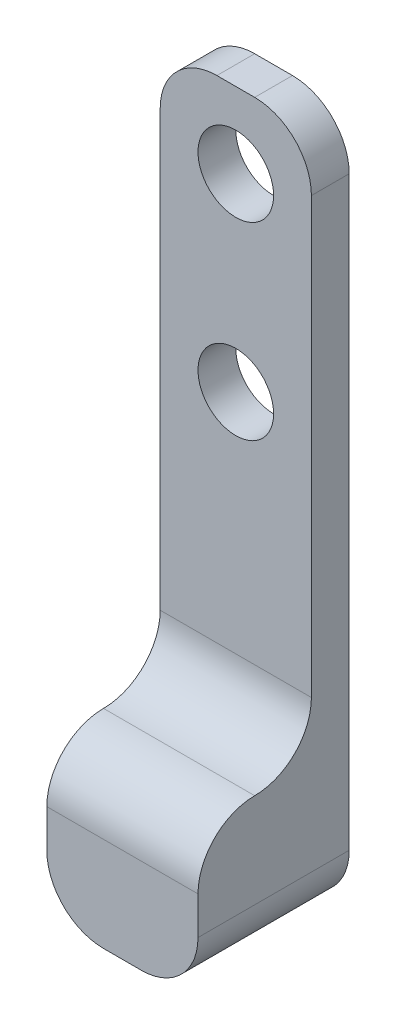
ISO-10303-21;
HEADER;
FILE_DESCRIPTION(('STEP AP214'),'2;1');
FILE_NAME('part.step','',(''),(''),'','','');
FILE_SCHEMA(('AUTOMOTIVE_DESIGN { 1 0 10303 214 1 1 1 1 }'));
ENDSEC;
DATA;
#1=APPLICATION_CONTEXT('core data for automotive mechanical design processes');
#2=APPLICATION_PROTOCOL_DEFINITION('international standard','automotive_design',2000,#1);
#3=PRODUCT_CONTEXT('',#1,'mechanical');
#4=PRODUCT('Part','Part','',(#3));
#5=PRODUCT_RELATED_PRODUCT_CATEGORY('part','',(#4));
#6=PRODUCT_DEFINITION_FORMATION('','',#4);
#7=PRODUCT_DEFINITION_CONTEXT('part definition',#1,'design');
#8=PRODUCT_DEFINITION('design','',#6,#7);
#9=PRODUCT_DEFINITION_SHAPE('','',#8);
#10=(LENGTH_UNIT() NAMED_UNIT(*) SI_UNIT(.MILLI.,.METRE.));
#11=(NAMED_UNIT(*) PLANE_ANGLE_UNIT() SI_UNIT($,.RADIAN.));
#12=(NAMED_UNIT(*) SI_UNIT($,.STERADIAN.) SOLID_ANGLE_UNIT());
#13=UNCERTAINTY_MEASURE_WITH_UNIT(LENGTH_MEASURE(1.E-05),#10,'distance_accuracy_value','');
#14=(GEOMETRIC_REPRESENTATION_CONTEXT(3) GLOBAL_UNCERTAINTY_ASSIGNED_CONTEXT((#13)) GLOBAL_UNIT_ASSIGNED_CONTEXT((#10,
#11,#12)) REPRESENTATION_CONTEXT('',''));
#15=CARTESIAN_POINT('',(0.,0.,0.));
#16=DIRECTION('',(0.,0.,1.));
#17=DIRECTION('',(1.,0.,0.));
#18=AXIS2_PLACEMENT_3D('',#15,#16,#17);
#19=CARTESIAN_POINT('',(-27.9913294797688,-28.7911849710983,2.));
#20=DIRECTION('',(0.,1.,0.));
#21=DIRECTION('',(0.,0.,1.));
#22=AXIS2_PLACEMENT_3D('',#19,#20,#21);
#23=PLANE('',#22);
#24=DIRECTION('',(1.,0.,0.));
#25=VECTOR('',#24,1.);
#26=CARTESIAN_POINT('',(8.50867052023123,-28.7911849710983,8.));
#27=LINE('',#26,#25);
#28=CARTESIAN_POINT('',(3.50867052023122,-28.7911849710983,8.));
#29=VERTEX_POINT('',#28);
#30=CARTESIAN_POINT('',(5.50867052023123,-28.7911849710983,8.));
#31=VERTEX_POINT('',#30);
#32=EDGE_CURVE('E157',#29,#31,#27,.T.);
#33=ORIENTED_EDGE('',*,*,#32,.F.);
#34=DIRECTION('',(0.,0.,-1.));
#35=VECTOR('',#34,1.);
#36=CARTESIAN_POINT('',(3.50867052023122,-28.7911849710983,2.));
#37=LINE('',#36,#35);
#38=CARTESIAN_POINT('',(3.50867052023122,-28.7911849710983,0.));
#39=VERTEX_POINT('',#38);
#40=EDGE_CURVE('E207',#29,#39,#37,.T.);
#41=ORIENTED_EDGE('',*,*,#40,.T.);
#42=DIRECTION('',(1.,0.,0.));
#43=VECTOR('',#42,1.);
#44=CARTESIAN_POINT('',(-27.9913294797688,-28.7911849710983,0.));
#45=LINE('',#44,#43);
#46=CARTESIAN_POINT('',(5.50867052023123,-28.7911849710983,0.));
#47=VERTEX_POINT('',#46);
#48=EDGE_CURVE('E172',#39,#47,#45,.T.);
#49=ORIENTED_EDGE('',*,*,#48,.T.);
#50=DIRECTION('',(0.,0.,-1.));
#51=VECTOR('',#50,1.);
#52=CARTESIAN_POINT('',(5.50867052023123,-28.7911849710983,2.));
#53=LINE('',#52,#51);
#54=EDGE_CURVE('E205',#47,#31,#53,.F.);
#55=ORIENTED_EDGE('',*,*,#54,.T.);
#56=EDGE_LOOP('',(#33,#41,#49,#55));
#57=FACE_BOUND('',#56,.T.);
#58=ADVANCED_FACE('F33',(#57),#23,.F.);
#59=CARTESIAN_POINT('',(0.,0.,2.));
#60=DIRECTION('',(0.,0.,1.));
#61=DIRECTION('',(1.,0.,0.));
#62=AXIS2_PLACEMENT_3D('',#59,#60,#61);
#63=PLANE('',#62);
#64=CARTESIAN_POINT('',(4.50867052023123,4.20881502890173,2.));
#65=DIRECTION('',(0.,0.,1.));
#66=DIRECTION('',(1.,0.,0.));
#67=AXIS2_PLACEMENT_3D('',#64,#65,#66);
#68=CIRCLE('',#67,1.99999999999999);
#69=CARTESIAN_POINT('',(6.50867052023121,4.20881502890173,2.));
#70=VERTEX_POINT('',#69);
#71=EDGE_CURVE('E160',#70,#70,#68,.T.);
#72=ORIENTED_EDGE('',*,*,#71,.F.);
#73=EDGE_LOOP('',(#72));
#74=FACE_BOUND('',#73,.T.);
#75=CARTESIAN_POINT('',(4.50867052023123,-5.79118497109827,2.));
#76=DIRECTION('',(0.,0.,1.));
#77=DIRECTION('',(1.,0.,0.));
#78=AXIS2_PLACEMENT_3D('',#75,#76,#77);
#79=CIRCLE('',#78,1.99999999999999);
#80=CARTESIAN_POINT('',(6.50867052023121,-5.79118497109827,2.));
#81=VERTEX_POINT('',#80);
#82=EDGE_CURVE('E166',#81,#81,#79,.T.);
#83=ORIENTED_EDGE('',*,*,#82,.F.);
#84=EDGE_LOOP('',(#83));
#85=FACE_BOUND('',#84,.T.);
#86=DIRECTION('',(0.,1.,0.));
#87=VECTOR('',#86,1.);
#88=CARTESIAN_POINT('',(0.508670520231226,0.,2.));
#89=LINE('',#88,#87);
#90=CARTESIAN_POINT('',(0.508670520231226,-17.7911849710983,2.));
#91=VERTEX_POINT('',#90);
#92=CARTESIAN_POINT('',(0.508670520231226,5.20881502890173,2.));
#93=VERTEX_POINT('',#92);
#94=EDGE_CURVE('E132',#91,#93,#89,.T.);
#95=ORIENTED_EDGE('',*,*,#94,.F.);
#96=DIRECTION('',(-1.,0.,0.));
#97=VECTOR('',#96,1.);
#98=CARTESIAN_POINT('',(0.,-17.7911849710983,2.));
#99=LINE('',#98,#97);
#100=CARTESIAN_POINT('',(8.50867052023122,-17.7911849710983,2.));
#101=VERTEX_POINT('',#100);
#102=EDGE_CURVE('E121',#91,#101,#99,.F.);
#103=ORIENTED_EDGE('',*,*,#102,.T.);
#104=DIRECTION('',(0.,1.,0.));
#105=VECTOR('',#104,1.);
#106=CARTESIAN_POINT('',(8.50867052023122,0.,2.));
#107=LINE('',#106,#105);
#108=CARTESIAN_POINT('',(8.50867052023122,5.20881502890173,2.));
#109=VERTEX_POINT('',#108);
#110=EDGE_CURVE('E130',#101,#109,#107,.T.);
#111=ORIENTED_EDGE('',*,*,#110,.T.);
#112=CARTESIAN_POINT('',(5.50867052023123,5.20881502890173,2.));
#113=DIRECTION('',(0.,0.,1.));
#114=DIRECTION('',(1.,0.,0.));
#115=AXIS2_PLACEMENT_3D('',#112,#113,#114);
#116=CIRCLE('',#115,3.);
#117=CARTESIAN_POINT('',(5.50867052023123,8.20881502890173,2.));
#118=VERTEX_POINT('',#117);
#119=EDGE_CURVE('E174',#109,#118,#116,.T.);
#120=ORIENTED_EDGE('',*,*,#119,.T.);
#121=DIRECTION('',(1.,0.,0.));
#122=VECTOR('',#121,1.);
#123=CARTESIAN_POINT('',(0.,8.20881502890173,2.));
#124=LINE('',#123,#122);
#125=CARTESIAN_POINT('',(3.50867052023123,8.20881502890173,2.));
#126=VERTEX_POINT('',#125);
#127=EDGE_CURVE('E142',#126,#118,#124,.T.);
#128=ORIENTED_EDGE('',*,*,#127,.F.);
#129=CARTESIAN_POINT('',(3.50867052023123,5.20881502890173,2.));
#130=DIRECTION('',(0.,0.,1.));
#131=DIRECTION('',(1.,0.,0.));
#132=AXIS2_PLACEMENT_3D('',#129,#130,#131);
#133=CIRCLE('',#132,3.);
#134=EDGE_CURVE('E134',#126,#93,#133,.T.);
#135=ORIENTED_EDGE('',*,*,#134,.T.);
#136=EDGE_LOOP('',(#95,#103,#111,#120,#128,#135));
#137=FACE_BOUND('',#136,.T.);
#138=ADVANCED_FACE('F129',(#74,#85,#137),#63,.T.);
#139=CARTESIAN_POINT('',(0.,0.,0.));
#140=DIRECTION('',(0.,0.,1.));
#141=DIRECTION('',(1.,0.,0.));
#142=AXIS2_PLACEMENT_3D('',#139,#140,#141);
#143=PLANE('',#142);
#144=CARTESIAN_POINT('',(4.50867052023123,-5.79118497109827,0.));
#145=DIRECTION('',(0.,0.,1.));
#146=DIRECTION('',(1.,0.,0.));
#147=AXIS2_PLACEMENT_3D('',#144,#145,#146);
#148=CIRCLE('',#147,2.);
#149=CARTESIAN_POINT('',(6.50867052023122,-5.79118497109827,0.));
#150=VERTEX_POINT('',#149);
#151=EDGE_CURVE('E169',#150,#150,#148,.T.);
#152=ORIENTED_EDGE('',*,*,#151,.T.);
#153=EDGE_LOOP('',(#152));
#154=FACE_BOUND('',#153,.T.);
#155=CARTESIAN_POINT('',(4.50867052023123,4.20881502890173,0.));
#156=DIRECTION('',(0.,0.,1.));
#157=DIRECTION('',(1.,0.,0.));
#158=AXIS2_PLACEMENT_3D('',#155,#156,#157);
#159=CIRCLE('',#158,2.);
#160=CARTESIAN_POINT('',(6.50867052023122,4.20881502890173,0.));
#161=VERTEX_POINT('',#160);
#162=EDGE_CURVE('E163',#161,#161,#159,.T.);
#163=ORIENTED_EDGE('',*,*,#162,.T.);
#164=EDGE_LOOP('',(#163));
#165=FACE_BOUND('',#164,.T.);
#166=DIRECTION('',(0.,1.,0.));
#167=VECTOR('',#166,1.);
#168=CARTESIAN_POINT('',(0.508670520231226,0.,0.));
#169=LINE('',#168,#167);
#170=CARTESIAN_POINT('',(0.508670520231225,-25.7911849710983,0.));
#171=VERTEX_POINT('',#170);
#172=CARTESIAN_POINT('',(0.508670520231226,5.20881502890173,0.));
#173=VERTEX_POINT('',#172);
#174=EDGE_CURVE('E229',#171,#173,#169,.T.);
#175=ORIENTED_EDGE('',*,*,#174,.T.);
#176=CARTESIAN_POINT('',(3.50867052023123,5.20881502890173,0.));
#177=DIRECTION('',(0.,0.,1.));
#178=DIRECTION('',(1.,0.,0.));
#179=AXIS2_PLACEMENT_3D('',#176,#177,#178);
#180=CIRCLE('',#179,3.);
#181=CARTESIAN_POINT('',(3.50867052023123,8.20881502890173,0.));
#182=VERTEX_POINT('',#181);
#183=EDGE_CURVE('E203',#173,#182,#180,.F.);
#184=ORIENTED_EDGE('',*,*,#183,.T.);
#185=DIRECTION('',(1.,0.,0.));
#186=VECTOR('',#185,1.);
#187=CARTESIAN_POINT('',(0.,8.20881502890173,0.));
#188=LINE('',#187,#186);
#189=CARTESIAN_POINT('',(5.50867052023123,8.20881502890173,0.));
#190=VERTEX_POINT('',#189);
#191=EDGE_CURVE('E145',#182,#190,#188,.T.);
#192=ORIENTED_EDGE('',*,*,#191,.T.);
#193=CARTESIAN_POINT('',(5.50867052023123,5.20881502890173,0.));
#194=DIRECTION('',(0.,0.,1.));
#195=DIRECTION('',(1.,0.,0.));
#196=AXIS2_PLACEMENT_3D('',#193,#194,#195);
#197=CIRCLE('',#196,3.);
#198=CARTESIAN_POINT('',(8.50867052023122,5.20881502890173,0.));
#199=VERTEX_POINT('',#198);
#200=EDGE_CURVE('E201',#190,#199,#197,.F.);
#201=ORIENTED_EDGE('',*,*,#200,.T.);
#202=DIRECTION('',(0.,1.,0.));
#203=VECTOR('',#202,1.);
#204=CARTESIAN_POINT('',(8.50867052023122,0.,0.));
#205=LINE('',#204,#203);
#206=CARTESIAN_POINT('',(8.50867052023122,-25.7911849710983,0.));
#207=VERTEX_POINT('',#206);
#208=EDGE_CURVE('E150',#207,#199,#205,.T.);
#209=ORIENTED_EDGE('',*,*,#208,.F.);
#210=CARTESIAN_POINT('',(5.50867052023123,-25.7911849710983,0.));
#211=DIRECTION('',(0.,0.,1.));
#212=DIRECTION('',(1.,0.,0.));
#213=AXIS2_PLACEMENT_3D('',#210,#211,#212);
#214=CIRCLE('',#213,3.);
#215=EDGE_CURVE('E49',#207,#47,#214,.F.);
#216=ORIENTED_EDGE('',*,*,#215,.T.);
#217=ORIENTED_EDGE('',*,*,#48,.F.);
#218=CARTESIAN_POINT('',(3.50867052023122,-25.7911849710983,0.));
#219=DIRECTION('',(0.,0.,1.));
#220=DIRECTION('',(1.,0.,0.));
#221=AXIS2_PLACEMENT_3D('',#218,#219,#220);
#222=CIRCLE('',#221,3.);
#223=EDGE_CURVE('E57',#39,#171,#222,.F.);
#224=ORIENTED_EDGE('',*,*,#223,.T.);
#225=EDGE_LOOP('',(#175,#184,#192,#201,#209,#216,#217,#224));
#226=FACE_BOUND('',#225,.T.);
#227=ADVANCED_FACE('F226',(#154,#165,#226),#143,.F.);
#228=CARTESIAN_POINT('',(4.50867052023123,-5.79118497109827,2.));
#229=DIRECTION('',(0.,0.,1.));
#230=DIRECTION('',(1.,0.,0.));
#231=AXIS2_PLACEMENT_3D('',#228,#229,#230);
#232=CYLINDRICAL_SURFACE('',#231,1.99999999999999);
#233=ORIENTED_EDGE('',*,*,#151,.F.);
#234=EDGE_LOOP('',(#233));
#235=FACE_BOUND('',#234,.T.);
#236=ORIENTED_EDGE('',*,*,#82,.T.);
#237=EDGE_LOOP('',(#236));
#238=FACE_BOUND('',#237,.T.);
#239=ADVANCED_FACE('F343',(#235,#238),#232,.F.);
#240=CARTESIAN_POINT('',(4.50867052023123,4.20881502890173,2.));
#241=DIRECTION('',(0.,0.,1.));
#242=DIRECTION('',(1.,0.,0.));
#243=AXIS2_PLACEMENT_3D('',#240,#241,#242);
#244=CYLINDRICAL_SURFACE('',#243,1.99999999999999);
#245=ORIENTED_EDGE('',*,*,#162,.F.);
#246=EDGE_LOOP('',(#245));
#247=FACE_BOUND('',#246,.T.);
#248=ORIENTED_EDGE('',*,*,#71,.T.);
#249=EDGE_LOOP('',(#248));
#250=FACE_BOUND('',#249,.T.);
#251=ADVANCED_FACE('F333',(#247,#250),#244,.F.);
#252=CARTESIAN_POINT('',(8.50867052023123,-28.7911849710983,8.));
#253=DIRECTION('',(-1.,0.,0.));
#254=DIRECTION('',(0.,0.,1.));
#255=AXIS2_PLACEMENT_3D('',#252,#253,#254);
#256=PLANE('',#255);
#257=ORIENTED_EDGE('',*,*,#110,.F.);
#258=CARTESIAN_POINT('',(8.50867052023123,-17.7911849710983,5.));
#259=DIRECTION('',(-1.,0.,0.));
#260=DIRECTION('',(0.,0.,1.));
#261=AXIS2_PLACEMENT_3D('',#258,#259,#260);
#262=CIRCLE('',#261,3.);
#263=CARTESIAN_POINT('',(8.50867052023123,-20.7911849710983,5.));
#264=VERTEX_POINT('',#263);
#265=EDGE_CURVE('E11',#101,#264,#262,.T.);
#266=ORIENTED_EDGE('',*,*,#265,.T.);
#267=CARTESIAN_POINT('',(8.50867052023123,-23.7911849710983,5.));
#268=DIRECTION('',(-1.,0.,0.));
#269=DIRECTION('',(0.,0.,1.));
#270=AXIS2_PLACEMENT_3D('',#267,#268,#269);
#271=CIRCLE('',#270,3.);
#272=CARTESIAN_POINT('',(8.50867052023123,-23.7911849710983,8.));
#273=VERTEX_POINT('',#272);
#274=EDGE_CURVE('E192',#264,#273,#271,.F.);
#275=ORIENTED_EDGE('',*,*,#274,.T.);
#276=DIRECTION('',(0.,1.,0.));
#277=VECTOR('',#276,1.);
#278=CARTESIAN_POINT('',(8.50867052023123,-28.7911849710983,8.));
#279=LINE('',#278,#277);
#280=CARTESIAN_POINT('',(8.50867052023123,-25.7911849710983,8.));
#281=VERTEX_POINT('',#280);
#282=EDGE_CURVE('E151',#281,#273,#279,.T.);
#283=ORIENTED_EDGE('',*,*,#282,.F.);
#284=DIRECTION('',(0.,0.,-1.));
#285=VECTOR('',#284,1.);
#286=CARTESIAN_POINT('',(8.50867052023123,-25.7911849710983,8.));
#287=LINE('',#286,#285);
#288=EDGE_CURVE('E188',#281,#207,#287,.T.);
#289=ORIENTED_EDGE('',*,*,#288,.T.);
#290=ORIENTED_EDGE('',*,*,#208,.T.);
#291=DIRECTION('',(0.,0.,1.));
#292=VECTOR('',#291,1.);
#293=CARTESIAN_POINT('',(8.50867052023123,5.20881502890173,8.));
#294=LINE('',#293,#292);
#295=EDGE_CURVE('E140',#199,#109,#294,.T.);
#296=ORIENTED_EDGE('',*,*,#295,.T.);
#297=EDGE_LOOP('',(#257,#266,#275,#283,#289,#290,#296));
#298=FACE_BOUND('',#297,.T.);
#299=ADVANCED_FACE('F137',(#298),#256,.F.);
#300=CARTESIAN_POINT('',(0.508670520231225,-28.7911849710983,8.));
#301=DIRECTION('',(1.,0.,0.));
#302=DIRECTION('',(0.,1.,0.));
#303=AXIS2_PLACEMENT_3D('',#300,#301,#302);
#304=PLANE('',#303);
#305=DIRECTION('',(0.,-1.,0.));
#306=VECTOR('',#305,1.);
#307=CARTESIAN_POINT('',(0.508670520231225,-28.7911849710983,8.));
#308=LINE('',#307,#306);
#309=CARTESIAN_POINT('',(0.508670520231225,-23.7911849710983,8.));
#310=VERTEX_POINT('',#309);
#311=CARTESIAN_POINT('',(0.508670520231225,-25.7911849710983,8.));
#312=VERTEX_POINT('',#311);
#313=EDGE_CURVE('E154',#310,#312,#308,.T.);
#314=ORIENTED_EDGE('',*,*,#313,.F.);
#315=CARTESIAN_POINT('',(0.508670520231225,-23.7911849710983,5.));
#316=DIRECTION('',(1.,0.,0.));
#317=DIRECTION('',(0.,1.,0.));
#318=AXIS2_PLACEMENT_3D('',#315,#316,#317);
#319=CIRCLE('',#318,3.);
#320=CARTESIAN_POINT('',(0.508670520231225,-20.7911849710983,5.));
#321=VERTEX_POINT('',#320);
#322=EDGE_CURVE('E186',#310,#321,#319,.F.);
#323=ORIENTED_EDGE('',*,*,#322,.T.);
#324=CARTESIAN_POINT('',(0.508670520231225,-17.7911849710983,5.));
#325=DIRECTION('',(1.,0.,0.));
#326=DIRECTION('',(0.,1.,0.));
#327=AXIS2_PLACEMENT_3D('',#324,#325,#326);
#328=CIRCLE('',#327,3.);
#329=EDGE_CURVE('E42',#321,#91,#328,.T.);
#330=ORIENTED_EDGE('',*,*,#329,.T.);
#331=ORIENTED_EDGE('',*,*,#94,.T.);
#332=DIRECTION('',(0.,0.,1.));
#333=VECTOR('',#332,1.);
#334=CARTESIAN_POINT('',(0.508670520231226,5.20881502890173,8.));
#335=LINE('',#334,#333);
#336=EDGE_CURVE('E184',#93,#173,#335,.F.);
#337=ORIENTED_EDGE('',*,*,#336,.T.);
#338=ORIENTED_EDGE('',*,*,#174,.F.);
#339=DIRECTION('',(0.,0.,-1.));
#340=VECTOR('',#339,1.);
#341=CARTESIAN_POINT('',(0.508670520231225,-25.7911849710983,8.));
#342=LINE('',#341,#340);
#343=EDGE_CURVE('E182',#171,#312,#342,.F.);
#344=ORIENTED_EDGE('',*,*,#343,.T.);
#345=EDGE_LOOP('',(#314,#323,#330,#331,#337,#338,#344));
#346=FACE_BOUND('',#345,.T.);
#347=ADVANCED_FACE('F211',(#346),#304,.F.);
#348=CARTESIAN_POINT('',(0.,0.,8.));
#349=DIRECTION('',(0.,0.,1.));
#350=DIRECTION('',(1.,0.,0.));
#351=AXIS2_PLACEMENT_3D('',#348,#349,#350);
#352=PLANE('',#351);
#353=ORIENTED_EDGE('',*,*,#282,.T.);
#354=DIRECTION('',(-1.,0.,0.));
#355=VECTOR('',#354,1.);
#356=CARTESIAN_POINT('',(0.508670520231225,-23.7911849710983,8.));
#357=LINE('',#356,#355);
#358=EDGE_CURVE('E180',#273,#310,#357,.T.);
#359=ORIENTED_EDGE('',*,*,#358,.T.);
#360=ORIENTED_EDGE('',*,*,#313,.T.);
#361=CARTESIAN_POINT('',(3.50867052023122,-25.7911849710983,8.));
#362=DIRECTION('',(0.,0.,1.));
#363=DIRECTION('',(1.,0.,0.));
#364=AXIS2_PLACEMENT_3D('',#361,#362,#363);
#365=CIRCLE('',#364,3.);
#366=EDGE_CURVE('E178',#312,#29,#365,.T.);
#367=ORIENTED_EDGE('',*,*,#366,.T.);
#368=ORIENTED_EDGE('',*,*,#32,.T.);
#369=CARTESIAN_POINT('',(5.50867052023123,-25.7911849710983,8.));
#370=DIRECTION('',(0.,0.,1.));
#371=DIRECTION('',(1.,0.,0.));
#372=AXIS2_PLACEMENT_3D('',#369,#370,#371);
#373=CIRCLE('',#372,3.);
#374=EDGE_CURVE('E133',#31,#281,#373,.T.);
#375=ORIENTED_EDGE('',*,*,#374,.T.);
#376=EDGE_LOOP('',(#353,#359,#360,#367,#368,#375));
#377=FACE_BOUND('',#376,.T.);
#378=ADVANCED_FACE('F220',(#377),#352,.T.);
#379=CARTESIAN_POINT('',(0.,8.20881502890173,0.));
#380=DIRECTION('',(0.,-1.,0.));
#381=DIRECTION('',(0.,0.,-1.));
#382=AXIS2_PLACEMENT_3D('',#379,#380,#381);
#383=PLANE('',#382);
#384=ORIENTED_EDGE('',*,*,#191,.F.);
#385=DIRECTION('',(0.,0.,1.));
#386=VECTOR('',#385,1.);
#387=CARTESIAN_POINT('',(3.50867052023123,8.20881502890173,0.));
#388=LINE('',#387,#386);
#389=EDGE_CURVE('E196',#182,#126,#388,.T.);
#390=ORIENTED_EDGE('',*,*,#389,.T.);
#391=ORIENTED_EDGE('',*,*,#127,.T.);
#392=DIRECTION('',(0.,0.,1.));
#393=VECTOR('',#392,1.);
#394=CARTESIAN_POINT('',(5.50867052023123,8.20881502890173,0.));
#395=LINE('',#394,#393);
#396=EDGE_CURVE('E194',#118,#190,#395,.F.);
#397=ORIENTED_EDGE('',*,*,#396,.T.);
#398=EDGE_LOOP('',(#384,#390,#391,#397));
#399=FACE_BOUND('',#398,.T.);
#400=ADVANCED_FACE('F240',(#399),#383,.F.);
#401=CARTESIAN_POINT('',(0.,-23.7911849710983,5.));
#402=DIRECTION('',(1.,0.,0.));
#403=DIRECTION('',(0.,0.,-1.));
#404=AXIS2_PLACEMENT_3D('',#401,#402,#403);
#405=CYLINDRICAL_SURFACE('',#404,3.);
#406=ORIENTED_EDGE('',*,*,#358,.F.);
#407=ORIENTED_EDGE('',*,*,#274,.F.);
#408=DIRECTION('',(-1.,0.,0.));
#409=VECTOR('',#408,1.);
#410=CARTESIAN_POINT('',(8.50867052023123,-20.7911849710983,5.));
#411=LINE('',#410,#409);
#412=EDGE_CURVE('E37',#321,#264,#411,.F.);
#413=ORIENTED_EDGE('',*,*,#412,.F.);
#414=ORIENTED_EDGE('',*,*,#322,.F.);
#415=EDGE_LOOP('',(#406,#407,#413,#414));
#416=FACE_BOUND('',#415,.T.);
#417=ADVANCED_FACE('F216',(#416),#405,.T.);
#418=CARTESIAN_POINT('',(8.50867052023123,-17.7911849710983,5.));
#419=DIRECTION('',(-1.,0.,0.));
#420=DIRECTION('',(0.,0.,1.));
#421=AXIS2_PLACEMENT_3D('',#418,#419,#420);
#422=CYLINDRICAL_SURFACE('',#421,3.);
#423=ORIENTED_EDGE('',*,*,#265,.F.);
#424=ORIENTED_EDGE('',*,*,#102,.F.);
#425=ORIENTED_EDGE('',*,*,#329,.F.);
#426=ORIENTED_EDGE('',*,*,#412,.T.);
#427=EDGE_LOOP('',(#423,#424,#425,#426));
#428=FACE_BOUND('',#427,.T.);
#429=ADVANCED_FACE('F119',(#428),#422,.F.);
#430=CARTESIAN_POINT('',(3.50867052023123,5.20881502890173,0.));
#431=DIRECTION('',(0.,0.,1.));
#432=DIRECTION('',(1.,0.,0.));
#433=AXIS2_PLACEMENT_3D('',#430,#431,#432);
#434=CYLINDRICAL_SURFACE('',#433,3.);
#435=ORIENTED_EDGE('',*,*,#183,.F.);
#436=ORIENTED_EDGE('',*,*,#336,.F.);
#437=ORIENTED_EDGE('',*,*,#134,.F.);
#438=ORIENTED_EDGE('',*,*,#389,.F.);
#439=EDGE_LOOP('',(#435,#436,#437,#438));
#440=FACE_BOUND('',#439,.T.);
#441=ADVANCED_FACE('F242',(#440),#434,.T.);
#442=CARTESIAN_POINT('',(5.50867052023123,5.20881502890173,8.));
#443=DIRECTION('',(0.,0.,1.));
#444=DIRECTION('',(1.,0.,0.));
#445=AXIS2_PLACEMENT_3D('',#442,#443,#444);
#446=CYLINDRICAL_SURFACE('',#445,3.);
#447=ORIENTED_EDGE('',*,*,#200,.F.);
#448=ORIENTED_EDGE('',*,*,#396,.F.);
#449=ORIENTED_EDGE('',*,*,#119,.F.);
#450=ORIENTED_EDGE('',*,*,#295,.F.);
#451=EDGE_LOOP('',(#447,#448,#449,#450));
#452=FACE_BOUND('',#451,.T.);
#453=ADVANCED_FACE('F238',(#452),#446,.T.);
#454=CARTESIAN_POINT('',(3.50867052023122,-25.7911849710983,2.));
#455=DIRECTION('',(0.,0.,-1.));
#456=DIRECTION('',(-1.,0.,0.));
#457=AXIS2_PLACEMENT_3D('',#454,#455,#456);
#458=CYLINDRICAL_SURFACE('',#457,3.);
#459=ORIENTED_EDGE('',*,*,#366,.F.);
#460=ORIENTED_EDGE('',*,*,#343,.F.);
#461=ORIENTED_EDGE('',*,*,#223,.F.);
#462=ORIENTED_EDGE('',*,*,#40,.F.);
#463=EDGE_LOOP('',(#459,#460,#461,#462));
#464=FACE_BOUND('',#463,.T.);
#465=ADVANCED_FACE('F244',(#464),#458,.T.);
#466=CARTESIAN_POINT('',(5.50867052023123,-25.7911849710983,8.));
#467=DIRECTION('',(0.,0.,-1.));
#468=DIRECTION('',(-1.,0.,0.));
#469=AXIS2_PLACEMENT_3D('',#466,#467,#468);
#470=CYLINDRICAL_SURFACE('',#469,3.);
#471=ORIENTED_EDGE('',*,*,#374,.F.);
#472=ORIENTED_EDGE('',*,*,#54,.F.);
#473=ORIENTED_EDGE('',*,*,#215,.F.);
#474=ORIENTED_EDGE('',*,*,#288,.F.);
#475=EDGE_LOOP('',(#471,#472,#473,#474));
#476=FACE_BOUND('',#475,.T.);
#477=ADVANCED_FACE('F35',(#476),#470,.T.);
#478=CLOSED_SHELL('',(#58,#138,#227,#239,#251,#299,#347,#378,#400,#417,#429,#441,#453,#465,#477));
#479=MANIFOLD_SOLID_BREP('B2',#478);
#480=ADVANCED_BREP_SHAPE_REPRESENTATION('',(#18,#479),#14);
#481=SHAPE_DEFINITION_REPRESENTATION(#9,#480);
ENDSEC;
END-ISO-10303-21;
